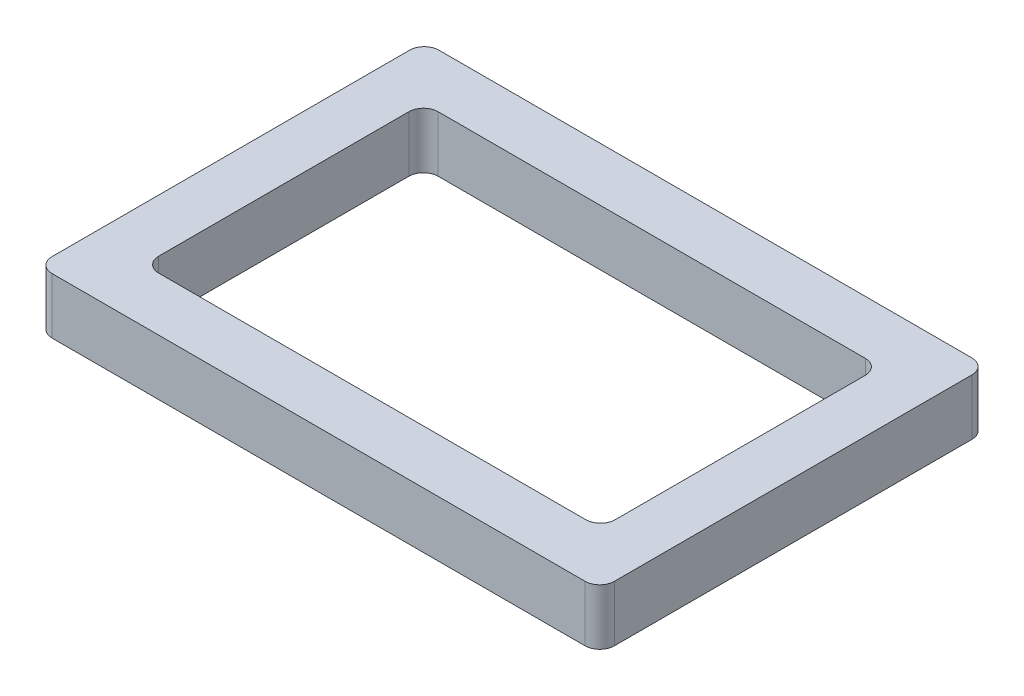
ISO-10303-21;
HEADER;
FILE_DESCRIPTION(('STEP AP214'),'2;1');
FILE_NAME('part.step','',(''),(''),'','','');
FILE_SCHEMA(('AUTOMOTIVE_DESIGN { 1 0 10303 214 1 1 1 1 }'));
ENDSEC;
DATA;
#1=APPLICATION_CONTEXT('core data for automotive mechanical design processes');
#2=APPLICATION_PROTOCOL_DEFINITION('international standard','automotive_design',2000,#1);
#3=PRODUCT_CONTEXT('',#1,'mechanical');
#4=PRODUCT('Part','Part','',(#3));
#5=PRODUCT_RELATED_PRODUCT_CATEGORY('part','',(#4));
#6=PRODUCT_DEFINITION_FORMATION('','',#4);
#7=PRODUCT_DEFINITION_CONTEXT('part definition',#1,'design');
#8=PRODUCT_DEFINITION('design','',#6,#7);
#9=PRODUCT_DEFINITION_SHAPE('','',#8);
#10=(LENGTH_UNIT() NAMED_UNIT(*) SI_UNIT(.MILLI.,.METRE.));
#11=(NAMED_UNIT(*) PLANE_ANGLE_UNIT() SI_UNIT($,.RADIAN.));
#12=(NAMED_UNIT(*) SI_UNIT($,.STERADIAN.) SOLID_ANGLE_UNIT());
#13=UNCERTAINTY_MEASURE_WITH_UNIT(LENGTH_MEASURE(1.E-05),#10,'distance_accuracy_value','');
#14=(GEOMETRIC_REPRESENTATION_CONTEXT(3) GLOBAL_UNCERTAINTY_ASSIGNED_CONTEXT((#13)) GLOBAL_UNIT_ASSIGNED_CONTEXT((#10,
#11,#12)) REPRESENTATION_CONTEXT('',''));
#15=CARTESIAN_POINT('',(0.,0.,0.));
#16=DIRECTION('',(0.,0.,1.));
#17=DIRECTION('',(1.,0.,0.));
#18=AXIS2_PLACEMENT_3D('',#15,#16,#17);
#19=CARTESIAN_POINT('',(-181.65,38.1,-121.85));
#20=DIRECTION('',(0.,-1.,0.));
#21=DIRECTION('',(0.,0.,-1.));
#22=AXIS2_PLACEMENT_3D('',#19,#20,#21);
#23=PLANE('',#22);
#24=CARTESIAN_POINT('',(-181.65,38.1,-121.85));
#25=DIRECTION('',(0.,1.,0.));
#26=DIRECTION('',(0.,0.,-1.));
#27=AXIS2_PLACEMENT_3D('',#24,#25,#26);
#28=CIRCLE('',#27,10.);
#29=CARTESIAN_POINT('',(-181.65,38.1,-131.85));
#30=VERTEX_POINT('',#29);
#31=CARTESIAN_POINT('',(-191.65,38.1,-121.85));
#32=VERTEX_POINT('',#31);
#33=EDGE_CURVE('E211',#30,#32,#28,.T.);
#34=ORIENTED_EDGE('',*,*,#33,.T.);
#35=DIRECTION('',(0.,0.,1.));
#36=VECTOR('',#35,1.);
#37=CARTESIAN_POINT('',(-191.65,38.1,121.85));
#38=LINE('',#37,#36);
#39=CARTESIAN_POINT('',(-191.65,38.1,121.85));
#40=VERTEX_POINT('',#39);
#41=EDGE_CURVE('E214',#32,#40,#38,.T.);
#42=ORIENTED_EDGE('',*,*,#41,.T.);
#43=CARTESIAN_POINT('',(-181.65,38.1,121.85));
#44=DIRECTION('',(0.,1.,0.));
#45=DIRECTION('',(0.,0.,1.));
#46=AXIS2_PLACEMENT_3D('',#43,#44,#45);
#47=CIRCLE('',#46,10.);
#48=CARTESIAN_POINT('',(-181.65,38.1,131.85));
#49=VERTEX_POINT('',#48);
#50=EDGE_CURVE('E217',#40,#49,#47,.T.);
#51=ORIENTED_EDGE('',*,*,#50,.T.);
#52=DIRECTION('',(1.,0.,0.));
#53=VECTOR('',#52,1.);
#54=CARTESIAN_POINT('',(-181.65,38.1,131.85));
#55=LINE('',#54,#53);
#56=CARTESIAN_POINT('',(181.65,38.1,131.85));
#57=VERTEX_POINT('',#56);
#58=EDGE_CURVE('E219',#49,#57,#55,.T.);
#59=ORIENTED_EDGE('',*,*,#58,.T.);
#60=CARTESIAN_POINT('',(181.65,38.1,121.85));
#61=DIRECTION('',(0.,1.,0.));
#62=DIRECTION('',(0.,0.,1.));
#63=AXIS2_PLACEMENT_3D('',#60,#61,#62);
#64=CIRCLE('',#63,10.);
#65=CARTESIAN_POINT('',(191.65,38.1,121.85));
#66=VERTEX_POINT('',#65);
#67=EDGE_CURVE('E221',#57,#66,#64,.T.);
#68=ORIENTED_EDGE('',*,*,#67,.T.);
#69=DIRECTION('',(0.,0.,-1.));
#70=VECTOR('',#69,1.);
#71=CARTESIAN_POINT('',(191.65,38.1,121.85));
#72=LINE('',#71,#70);
#73=CARTESIAN_POINT('',(191.65,38.1,-121.85));
#74=VERTEX_POINT('',#73);
#75=EDGE_CURVE('E223',#66,#74,#72,.T.);
#76=ORIENTED_EDGE('',*,*,#75,.T.);
#77=CARTESIAN_POINT('',(181.65,38.1,-121.85));
#78=DIRECTION('',(0.,1.,0.));
#79=DIRECTION('',(0.,0.,1.));
#80=AXIS2_PLACEMENT_3D('',#77,#78,#79);
#81=CIRCLE('',#80,10.);
#82=CARTESIAN_POINT('',(181.65,38.1,-131.85));
#83=VERTEX_POINT('',#82);
#84=EDGE_CURVE('E225',#74,#83,#81,.T.);
#85=ORIENTED_EDGE('',*,*,#84,.T.);
#86=DIRECTION('',(-1.,0.,0.));
#87=VECTOR('',#86,1.);
#88=CARTESIAN_POINT('',(-181.65,38.1,-131.85));
#89=LINE('',#88,#87);
#90=EDGE_CURVE('E227',#83,#30,#89,.T.);
#91=ORIENTED_EDGE('',*,*,#90,.T.);
#92=EDGE_LOOP('',(#34,#42,#51,#59,#68,#76,#85,#91));
#93=FACE_BOUND('',#92,.T.);
#94=CARTESIAN_POINT('',(-145.575,38.1,-85.25));
#95=DIRECTION('',(0.,1.,0.));
#96=DIRECTION('',(0.,0.,1.));
#97=AXIS2_PLACEMENT_3D('',#94,#95,#96);
#98=CIRCLE('',#97,10.);
#99=CARTESIAN_POINT('',(-145.575,38.1,-95.25));
#100=VERTEX_POINT('',#99);
#101=CARTESIAN_POINT('',(-155.575,38.1,-85.25));
#102=VERTEX_POINT('',#101);
#103=EDGE_CURVE('E146',#100,#102,#98,.T.);
#104=ORIENTED_EDGE('',*,*,#103,.F.);
#105=DIRECTION('',(-1.,0.,0.));
#106=VECTOR('',#105,1.);
#107=CARTESIAN_POINT('',(-145.575,38.1,-95.25));
#108=LINE('',#107,#106);
#109=CARTESIAN_POINT('',(145.575,38.1,-95.25));
#110=VERTEX_POINT('',#109);
#111=EDGE_CURVE('E179',#110,#100,#108,.T.);
#112=ORIENTED_EDGE('',*,*,#111,.F.);
#113=CARTESIAN_POINT('',(145.575,38.1,-85.25));
#114=DIRECTION('',(0.,1.,0.));
#115=DIRECTION('',(0.,0.,1.));
#116=AXIS2_PLACEMENT_3D('',#113,#114,#115);
#117=CIRCLE('',#116,10.);
#118=CARTESIAN_POINT('',(155.575,38.1,-85.25));
#119=VERTEX_POINT('',#118);
#120=EDGE_CURVE('E177',#119,#110,#117,.T.);
#121=ORIENTED_EDGE('',*,*,#120,.F.);
#122=DIRECTION('',(0.,0.,-1.));
#123=VECTOR('',#122,1.);
#124=CARTESIAN_POINT('',(155.575,38.1,85.2499999999999));
#125=LINE('',#124,#123);
#126=CARTESIAN_POINT('',(155.575,38.1,85.2499999999999));
#127=VERTEX_POINT('',#126);
#128=EDGE_CURVE('E175',#127,#119,#125,.T.);
#129=ORIENTED_EDGE('',*,*,#128,.F.);
#130=CARTESIAN_POINT('',(145.575,38.1,85.25));
#131=DIRECTION('',(0.,1.,0.));
#132=DIRECTION('',(0.,0.,1.));
#133=AXIS2_PLACEMENT_3D('',#130,#131,#132);
#134=CIRCLE('',#133,10.);
#135=CARTESIAN_POINT('',(145.575,38.1,95.25));
#136=VERTEX_POINT('',#135);
#137=EDGE_CURVE('E173',#136,#127,#134,.T.);
#138=ORIENTED_EDGE('',*,*,#137,.F.);
#139=DIRECTION('',(1.,0.,0.));
#140=VECTOR('',#139,1.);
#141=CARTESIAN_POINT('',(-145.575,38.1,95.25));
#142=LINE('',#141,#140);
#143=CARTESIAN_POINT('',(-145.575,38.1,95.25));
#144=VERTEX_POINT('',#143);
#145=EDGE_CURVE('E169',#144,#136,#142,.T.);
#146=ORIENTED_EDGE('',*,*,#145,.F.);
#147=CARTESIAN_POINT('',(-145.575,38.1,85.25));
#148=DIRECTION('',(0.,1.,0.));
#149=DIRECTION('',(0.,0.,1.));
#150=AXIS2_PLACEMENT_3D('',#147,#148,#149);
#151=CIRCLE('',#150,10.);
#152=CARTESIAN_POINT('',(-155.575,38.1,85.2499999999999));
#153=VERTEX_POINT('',#152);
#154=EDGE_CURVE('E167',#153,#144,#151,.T.);
#155=ORIENTED_EDGE('',*,*,#154,.F.);
#156=DIRECTION('',(0.,0.,1.));
#157=VECTOR('',#156,1.);
#158=CARTESIAN_POINT('',(-155.575,38.1,85.2499999999999));
#159=LINE('',#158,#157);
#160=EDGE_CURVE('E154',#102,#153,#159,.T.);
#161=ORIENTED_EDGE('',*,*,#160,.F.);
#162=EDGE_LOOP('',(#104,#112,#121,#129,#138,#146,#155,#161));
#163=FACE_BOUND('',#162,.T.);
#164=ADVANCED_FACE('F33',(#93,#163),#23,.F.);
#165=CARTESIAN_POINT('',(-181.65,0.,-121.85));
#166=DIRECTION('',(0.,-1.,0.));
#167=DIRECTION('',(0.,0.,-1.));
#168=AXIS2_PLACEMENT_3D('',#165,#166,#167);
#169=PLANE('',#168);
#170=CARTESIAN_POINT('',(-181.65,0.,-121.85));
#171=DIRECTION('',(0.,1.,0.));
#172=DIRECTION('',(0.,0.,-1.));
#173=AXIS2_PLACEMENT_3D('',#170,#171,#172);
#174=CIRCLE('',#173,10.);
#175=CARTESIAN_POINT('',(-181.65,0.,-131.85));
#176=VERTEX_POINT('',#175);
#177=CARTESIAN_POINT('',(-191.65,0.,-121.85));
#178=VERTEX_POINT('',#177);
#179=EDGE_CURVE('E162',#176,#178,#174,.T.);
#180=ORIENTED_EDGE('',*,*,#179,.F.);
#181=DIRECTION('',(-1.,0.,0.));
#182=VECTOR('',#181,1.);
#183=CARTESIAN_POINT('',(-181.65,0.,-131.85));
#184=LINE('',#183,#182);
#185=CARTESIAN_POINT('',(181.65,0.,-131.85));
#186=VERTEX_POINT('',#185);
#187=EDGE_CURVE('E215',#186,#176,#184,.T.);
#188=ORIENTED_EDGE('',*,*,#187,.F.);
#189=CARTESIAN_POINT('',(181.65,0.,-121.85));
#190=DIRECTION('',(0.,1.,0.));
#191=DIRECTION('',(0.,0.,1.));
#192=AXIS2_PLACEMENT_3D('',#189,#190,#191);
#193=CIRCLE('',#192,10.);
#194=CARTESIAN_POINT('',(191.65,0.,-121.85));
#195=VERTEX_POINT('',#194);
#196=EDGE_CURVE('E242',#195,#186,#193,.T.);
#197=ORIENTED_EDGE('',*,*,#196,.F.);
#198=DIRECTION('',(0.,0.,-1.));
#199=VECTOR('',#198,1.);
#200=CARTESIAN_POINT('',(191.65,0.,121.85));
#201=LINE('',#200,#199);
#202=CARTESIAN_POINT('',(191.65,0.,121.85));
#203=VERTEX_POINT('',#202);
#204=EDGE_CURVE('E240',#203,#195,#201,.T.);
#205=ORIENTED_EDGE('',*,*,#204,.F.);
#206=CARTESIAN_POINT('',(181.65,0.,121.85));
#207=DIRECTION('',(0.,1.,0.));
#208=DIRECTION('',(0.,0.,1.));
#209=AXIS2_PLACEMENT_3D('',#206,#207,#208);
#210=CIRCLE('',#209,10.);
#211=CARTESIAN_POINT('',(181.65,0.,131.85));
#212=VERTEX_POINT('',#211);
#213=EDGE_CURVE('E238',#212,#203,#210,.T.);
#214=ORIENTED_EDGE('',*,*,#213,.F.);
#215=DIRECTION('',(1.,0.,0.));
#216=VECTOR('',#215,1.);
#217=CARTESIAN_POINT('',(-181.65,0.,131.85));
#218=LINE('',#217,#216);
#219=CARTESIAN_POINT('',(-181.65,0.,131.85));
#220=VERTEX_POINT('',#219);
#221=EDGE_CURVE('E236',#220,#212,#218,.T.);
#222=ORIENTED_EDGE('',*,*,#221,.F.);
#223=CARTESIAN_POINT('',(-181.65,0.,121.85));
#224=DIRECTION('',(0.,1.,0.));
#225=DIRECTION('',(0.,0.,1.));
#226=AXIS2_PLACEMENT_3D('',#223,#224,#225);
#227=CIRCLE('',#226,10.);
#228=CARTESIAN_POINT('',(-191.65,0.,121.85));
#229=VERTEX_POINT('',#228);
#230=EDGE_CURVE('E234',#229,#220,#227,.T.);
#231=ORIENTED_EDGE('',*,*,#230,.F.);
#232=DIRECTION('',(0.,0.,1.));
#233=VECTOR('',#232,1.);
#234=CARTESIAN_POINT('',(-191.65,0.,121.85));
#235=LINE('',#234,#233);
#236=EDGE_CURVE('E232',#178,#229,#235,.T.);
#237=ORIENTED_EDGE('',*,*,#236,.F.);
#238=EDGE_LOOP('',(#180,#188,#197,#205,#214,#222,#231,#237));
#239=FACE_BOUND('',#238,.T.);
#240=DIRECTION('',(-1.,0.,0.));
#241=VECTOR('',#240,1.);
#242=CARTESIAN_POINT('',(-145.575,0.,-95.25));
#243=LINE('',#242,#241);
#244=CARTESIAN_POINT('',(145.575,0.,-95.25));
#245=VERTEX_POINT('',#244);
#246=CARTESIAN_POINT('',(-145.575,0.,-95.25));
#247=VERTEX_POINT('',#246);
#248=EDGE_CURVE('E155',#245,#247,#243,.T.);
#249=ORIENTED_EDGE('',*,*,#248,.T.);
#250=CARTESIAN_POINT('',(-145.575,0.,-85.25));
#251=DIRECTION('',(0.,1.,0.));
#252=DIRECTION('',(0.,0.,1.));
#253=AXIS2_PLACEMENT_3D('',#250,#251,#252);
#254=CIRCLE('',#253,10.);
#255=CARTESIAN_POINT('',(-155.575,0.,-85.25));
#256=VERTEX_POINT('',#255);
#257=EDGE_CURVE('E56',#247,#256,#254,.T.);
#258=ORIENTED_EDGE('',*,*,#257,.T.);
#259=DIRECTION('',(0.,0.,1.));
#260=VECTOR('',#259,1.);
#261=CARTESIAN_POINT('',(-155.575,0.,85.2499999999999));
#262=LINE('',#261,#260);
#263=CARTESIAN_POINT('',(-155.575,0.,85.2499999999999));
#264=VERTEX_POINT('',#263);
#265=EDGE_CURVE('E161',#256,#264,#262,.T.);
#266=ORIENTED_EDGE('',*,*,#265,.T.);
#267=CARTESIAN_POINT('',(-145.575,0.,85.25));
#268=DIRECTION('',(0.,1.,0.));
#269=DIRECTION('',(0.,0.,1.));
#270=AXIS2_PLACEMENT_3D('',#267,#268,#269);
#271=CIRCLE('',#270,10.);
#272=CARTESIAN_POINT('',(-145.575,0.,95.25));
#273=VERTEX_POINT('',#272);
#274=EDGE_CURVE('E183',#264,#273,#271,.T.);
#275=ORIENTED_EDGE('',*,*,#274,.T.);
#276=DIRECTION('',(1.,0.,0.));
#277=VECTOR('',#276,1.);
#278=CARTESIAN_POINT('',(-145.575,0.,95.25));
#279=LINE('',#278,#277);
#280=CARTESIAN_POINT('',(145.575,0.,95.25));
#281=VERTEX_POINT('',#280);
#282=EDGE_CURVE('E186',#273,#281,#279,.T.);
#283=ORIENTED_EDGE('',*,*,#282,.T.);
#284=CARTESIAN_POINT('',(145.575,0.,85.25));
#285=DIRECTION('',(0.,1.,0.));
#286=DIRECTION('',(0.,0.,1.));
#287=AXIS2_PLACEMENT_3D('',#284,#285,#286);
#288=CIRCLE('',#287,10.);
#289=CARTESIAN_POINT('',(155.575,0.,85.2499999999999));
#290=VERTEX_POINT('',#289);
#291=EDGE_CURVE('E189',#281,#290,#288,.T.);
#292=ORIENTED_EDGE('',*,*,#291,.T.);
#293=DIRECTION('',(0.,0.,-1.));
#294=VECTOR('',#293,1.);
#295=CARTESIAN_POINT('',(155.575,0.,85.2499999999999));
#296=LINE('',#295,#294);
#297=CARTESIAN_POINT('',(155.575,0.,-85.25));
#298=VERTEX_POINT('',#297);
#299=EDGE_CURVE('E192',#290,#298,#296,.T.);
#300=ORIENTED_EDGE('',*,*,#299,.T.);
#301=CARTESIAN_POINT('',(145.575,0.,-85.25));
#302=DIRECTION('',(0.,1.,0.));
#303=DIRECTION('',(0.,0.,1.));
#304=AXIS2_PLACEMENT_3D('',#301,#302,#303);
#305=CIRCLE('',#304,10.);
#306=EDGE_CURVE('E195',#298,#245,#305,.T.);
#307=ORIENTED_EDGE('',*,*,#306,.T.);
#308=EDGE_LOOP('',(#249,#258,#266,#275,#283,#292,#300,#307));
#309=FACE_BOUND('',#308,.T.);
#310=ADVANCED_FACE('F272',(#239,#309),#169,.T.);
#311=CARTESIAN_POINT('',(-181.65,38.1,-121.85));
#312=DIRECTION('',(0.,-1.,0.));
#313=DIRECTION('',(0.,0.,-1.));
#314=AXIS2_PLACEMENT_3D('',#311,#312,#313);
#315=CYLINDRICAL_SURFACE('',#314,10.);
#316=ORIENTED_EDGE('',*,*,#179,.T.);
#317=DIRECTION('',(0.,-1.,0.));
#318=VECTOR('',#317,1.);
#319=CARTESIAN_POINT('',(-191.65,38.1,-121.85));
#320=LINE('',#319,#318);
#321=EDGE_CURVE('E11',#32,#178,#320,.T.);
#322=ORIENTED_EDGE('',*,*,#321,.F.);
#323=ORIENTED_EDGE('',*,*,#33,.F.);
#324=DIRECTION('',(0.,-1.,0.));
#325=VECTOR('',#324,1.);
#326=CARTESIAN_POINT('',(-181.65,38.1,-131.85));
#327=LINE('',#326,#325);
#328=EDGE_CURVE('E229',#30,#176,#327,.T.);
#329=ORIENTED_EDGE('',*,*,#328,.T.);
#330=EDGE_LOOP('',(#316,#322,#323,#329));
#331=FACE_BOUND('',#330,.T.);
#332=ADVANCED_FACE('F35',(#331),#315,.T.);
#333=CARTESIAN_POINT('',(-191.65,38.1,121.85));
#334=DIRECTION('',(1.,0.,0.));
#335=DIRECTION('',(0.,0.,-1.));
#336=AXIS2_PLACEMENT_3D('',#333,#334,#335);
#337=PLANE('',#336);
#338=ORIENTED_EDGE('',*,*,#236,.T.);
#339=DIRECTION('',(0.,-1.,0.));
#340=VECTOR('',#339,1.);
#341=CARTESIAN_POINT('',(-191.65,38.1,121.85));
#342=LINE('',#341,#340);
#343=EDGE_CURVE('E41',#40,#229,#342,.T.);
#344=ORIENTED_EDGE('',*,*,#343,.F.);
#345=ORIENTED_EDGE('',*,*,#41,.F.);
#346=ORIENTED_EDGE('',*,*,#321,.T.);
#347=EDGE_LOOP('',(#338,#344,#345,#346));
#348=FACE_BOUND('',#347,.T.);
#349=ADVANCED_FACE('F289',(#348),#337,.F.);
#350=CARTESIAN_POINT('',(-181.65,38.1,121.85));
#351=DIRECTION('',(0.,-1.,0.));
#352=DIRECTION('',(0.,0.,-1.));
#353=AXIS2_PLACEMENT_3D('',#350,#351,#352);
#354=CYLINDRICAL_SURFACE('',#353,10.);
#355=ORIENTED_EDGE('',*,*,#230,.T.);
#356=DIRECTION('',(0.,-1.,0.));
#357=VECTOR('',#356,1.);
#358=CARTESIAN_POINT('',(-181.65,38.1,131.85));
#359=LINE('',#358,#357);
#360=EDGE_CURVE('E259',#49,#220,#359,.T.);
#361=ORIENTED_EDGE('',*,*,#360,.F.);
#362=ORIENTED_EDGE('',*,*,#50,.F.);
#363=ORIENTED_EDGE('',*,*,#343,.T.);
#364=EDGE_LOOP('',(#355,#361,#362,#363));
#365=FACE_BOUND('',#364,.T.);
#366=ADVANCED_FACE('F266',(#365),#354,.T.);
#367=CARTESIAN_POINT('',(-181.65,38.1,131.85));
#368=DIRECTION('',(0.,0.,-1.));
#369=DIRECTION('',(-1.,0.,0.));
#370=AXIS2_PLACEMENT_3D('',#367,#368,#369);
#371=PLANE('',#370);
#372=ORIENTED_EDGE('',*,*,#221,.T.);
#373=DIRECTION('',(0.,-1.,0.));
#374=VECTOR('',#373,1.);
#375=CARTESIAN_POINT('',(181.65,38.1,131.85));
#376=LINE('',#375,#374);
#377=EDGE_CURVE('E256',#57,#212,#376,.T.);
#378=ORIENTED_EDGE('',*,*,#377,.F.);
#379=ORIENTED_EDGE('',*,*,#58,.F.);
#380=ORIENTED_EDGE('',*,*,#360,.T.);
#381=EDGE_LOOP('',(#372,#378,#379,#380));
#382=FACE_BOUND('',#381,.T.);
#383=ADVANCED_FACE('F278',(#382),#371,.F.);
#384=CARTESIAN_POINT('',(181.65,38.1,121.85));
#385=DIRECTION('',(0.,-1.,0.));
#386=DIRECTION('',(0.,0.,-1.));
#387=AXIS2_PLACEMENT_3D('',#384,#385,#386);
#388=CYLINDRICAL_SURFACE('',#387,10.);
#389=ORIENTED_EDGE('',*,*,#213,.T.);
#390=DIRECTION('',(0.,-1.,0.));
#391=VECTOR('',#390,1.);
#392=CARTESIAN_POINT('',(191.65,38.1,121.85));
#393=LINE('',#392,#391);
#394=EDGE_CURVE('E253',#66,#203,#393,.T.);
#395=ORIENTED_EDGE('',*,*,#394,.F.);
#396=ORIENTED_EDGE('',*,*,#67,.F.);
#397=ORIENTED_EDGE('',*,*,#377,.T.);
#398=EDGE_LOOP('',(#389,#395,#396,#397));
#399=FACE_BOUND('',#398,.T.);
#400=ADVANCED_FACE('F282',(#399),#388,.T.);
#401=CARTESIAN_POINT('',(191.65,38.1,121.85));
#402=DIRECTION('',(-1.,0.,0.));
#403=DIRECTION('',(0.,0.,1.));
#404=AXIS2_PLACEMENT_3D('',#401,#402,#403);
#405=PLANE('',#404);
#406=ORIENTED_EDGE('',*,*,#204,.T.);
#407=DIRECTION('',(0.,-1.,0.));
#408=VECTOR('',#407,1.);
#409=CARTESIAN_POINT('',(191.65,38.1,-121.85));
#410=LINE('',#409,#408);
#411=EDGE_CURVE('E250',#74,#195,#410,.T.);
#412=ORIENTED_EDGE('',*,*,#411,.F.);
#413=ORIENTED_EDGE('',*,*,#75,.F.);
#414=ORIENTED_EDGE('',*,*,#394,.T.);
#415=EDGE_LOOP('',(#406,#412,#413,#414));
#416=FACE_BOUND('',#415,.T.);
#417=ADVANCED_FACE('F302',(#416),#405,.F.);
#418=CARTESIAN_POINT('',(181.65,38.1,-121.85));
#419=DIRECTION('',(0.,-1.,0.));
#420=DIRECTION('',(0.,0.,-1.));
#421=AXIS2_PLACEMENT_3D('',#418,#419,#420);
#422=CYLINDRICAL_SURFACE('',#421,10.);
#423=ORIENTED_EDGE('',*,*,#196,.T.);
#424=DIRECTION('',(0.,-1.,0.));
#425=VECTOR('',#424,1.);
#426=CARTESIAN_POINT('',(181.65,38.1,-131.85));
#427=LINE('',#426,#425);
#428=EDGE_CURVE('E247',#83,#186,#427,.T.);
#429=ORIENTED_EDGE('',*,*,#428,.F.);
#430=ORIENTED_EDGE('',*,*,#84,.F.);
#431=ORIENTED_EDGE('',*,*,#411,.T.);
#432=EDGE_LOOP('',(#423,#429,#430,#431));
#433=FACE_BOUND('',#432,.T.);
#434=ADVANCED_FACE('F300',(#433),#422,.T.);
#435=CARTESIAN_POINT('',(-181.65,38.1,-131.85));
#436=DIRECTION('',(0.,0.,1.));
#437=DIRECTION('',(1.,0.,0.));
#438=AXIS2_PLACEMENT_3D('',#435,#436,#437);
#439=PLANE('',#438);
#440=ORIENTED_EDGE('',*,*,#187,.T.);
#441=ORIENTED_EDGE('',*,*,#328,.F.);
#442=ORIENTED_EDGE('',*,*,#90,.F.);
#443=ORIENTED_EDGE('',*,*,#428,.T.);
#444=EDGE_LOOP('',(#440,#441,#442,#443));
#445=FACE_BOUND('',#444,.T.);
#446=ADVANCED_FACE('F295',(#445),#439,.F.);
#447=CARTESIAN_POINT('',(-145.575,38.1,-85.25));
#448=DIRECTION('',(0.,-1.,0.));
#449=DIRECTION('',(0.,0.,-1.));
#450=AXIS2_PLACEMENT_3D('',#447,#448,#449);
#451=CYLINDRICAL_SURFACE('',#450,10.);
#452=ORIENTED_EDGE('',*,*,#257,.F.);
#453=DIRECTION('',(0.,-1.,0.));
#454=VECTOR('',#453,1.);
#455=CARTESIAN_POINT('',(-145.575,38.1,-95.25));
#456=LINE('',#455,#454);
#457=EDGE_CURVE('E150',#100,#247,#456,.T.);
#458=ORIENTED_EDGE('',*,*,#457,.F.);
#459=ORIENTED_EDGE('',*,*,#103,.T.);
#460=DIRECTION('',(0.,-1.,0.));
#461=VECTOR('',#460,1.);
#462=CARTESIAN_POINT('',(-155.575,38.1,-85.25));
#463=LINE('',#462,#461);
#464=EDGE_CURVE('E149',#102,#256,#463,.T.);
#465=ORIENTED_EDGE('',*,*,#464,.T.);
#466=EDGE_LOOP('',(#452,#458,#459,#465));
#467=FACE_BOUND('',#466,.T.);
#468=ADVANCED_FACE('F148',(#467),#451,.F.);
#469=CARTESIAN_POINT('',(-155.575,38.1,85.2499999999999));
#470=DIRECTION('',(1.,0.,0.));
#471=DIRECTION('',(0.,0.,-1.));
#472=AXIS2_PLACEMENT_3D('',#469,#470,#471);
#473=PLANE('',#472);
#474=ORIENTED_EDGE('',*,*,#265,.F.);
#475=ORIENTED_EDGE('',*,*,#464,.F.);
#476=ORIENTED_EDGE('',*,*,#160,.T.);
#477=DIRECTION('',(0.,-1.,0.));
#478=VECTOR('',#477,1.);
#479=CARTESIAN_POINT('',(-155.575,38.1,85.2499999999999));
#480=LINE('',#479,#478);
#481=EDGE_CURVE('E163',#153,#264,#480,.T.);
#482=ORIENTED_EDGE('',*,*,#481,.T.);
#483=EDGE_LOOP('',(#474,#475,#476,#482));
#484=FACE_BOUND('',#483,.T.);
#485=ADVANCED_FACE('F158',(#484),#473,.T.);
#486=CARTESIAN_POINT('',(-145.575,38.1,85.25));
#487=DIRECTION('',(0.,-1.,0.));
#488=DIRECTION('',(0.,0.,-1.));
#489=AXIS2_PLACEMENT_3D('',#486,#487,#488);
#490=CYLINDRICAL_SURFACE('',#489,10.);
#491=ORIENTED_EDGE('',*,*,#274,.F.);
#492=ORIENTED_EDGE('',*,*,#481,.F.);
#493=ORIENTED_EDGE('',*,*,#154,.T.);
#494=DIRECTION('',(0.,-1.,0.));
#495=VECTOR('',#494,1.);
#496=CARTESIAN_POINT('',(-145.575,38.1,95.25));
#497=LINE('',#496,#495);
#498=EDGE_CURVE('E208',#144,#273,#497,.T.);
#499=ORIENTED_EDGE('',*,*,#498,.T.);
#500=EDGE_LOOP('',(#491,#492,#493,#499));
#501=FACE_BOUND('',#500,.T.);
#502=ADVANCED_FACE('F327',(#501),#490,.F.);
#503=CARTESIAN_POINT('',(-145.575,38.1,95.25));
#504=DIRECTION('',(0.,0.,-1.));
#505=DIRECTION('',(-1.,0.,0.));
#506=AXIS2_PLACEMENT_3D('',#503,#504,#505);
#507=PLANE('',#506);
#508=ORIENTED_EDGE('',*,*,#282,.F.);
#509=ORIENTED_EDGE('',*,*,#498,.F.);
#510=ORIENTED_EDGE('',*,*,#145,.T.);
#511=DIRECTION('',(0.,-1.,0.));
#512=VECTOR('',#511,1.);
#513=CARTESIAN_POINT('',(145.575,38.1,95.25));
#514=LINE('',#513,#512);
#515=EDGE_CURVE('E206',#136,#281,#514,.T.);
#516=ORIENTED_EDGE('',*,*,#515,.T.);
#517=EDGE_LOOP('',(#508,#509,#510,#516));
#518=FACE_BOUND('',#517,.T.);
#519=ADVANCED_FACE('F331',(#518),#507,.T.);
#520=CARTESIAN_POINT('',(145.575,38.1,85.25));
#521=DIRECTION('',(0.,-1.,0.));
#522=DIRECTION('',(0.,0.,-1.));
#523=AXIS2_PLACEMENT_3D('',#520,#521,#522);
#524=CYLINDRICAL_SURFACE('',#523,10.);
#525=ORIENTED_EDGE('',*,*,#291,.F.);
#526=ORIENTED_EDGE('',*,*,#515,.F.);
#527=ORIENTED_EDGE('',*,*,#137,.T.);
#528=DIRECTION('',(0.,-1.,0.));
#529=VECTOR('',#528,1.);
#530=CARTESIAN_POINT('',(155.575,38.1,85.2499999999999));
#531=LINE('',#530,#529);
#532=EDGE_CURVE('E204',#127,#290,#531,.T.);
#533=ORIENTED_EDGE('',*,*,#532,.T.);
#534=EDGE_LOOP('',(#525,#526,#527,#533));
#535=FACE_BOUND('',#534,.T.);
#536=ADVANCED_FACE('F337',(#535),#524,.F.);
#537=CARTESIAN_POINT('',(155.575,38.1,85.2499999999999));
#538=DIRECTION('',(-1.,0.,0.));
#539=DIRECTION('',(0.,0.,1.));
#540=AXIS2_PLACEMENT_3D('',#537,#538,#539);
#541=PLANE('',#540);
#542=ORIENTED_EDGE('',*,*,#299,.F.);
#543=ORIENTED_EDGE('',*,*,#532,.F.);
#544=ORIENTED_EDGE('',*,*,#128,.T.);
#545=DIRECTION('',(0.,-1.,0.));
#546=VECTOR('',#545,1.);
#547=CARTESIAN_POINT('',(155.575,38.1,-85.25));
#548=LINE('',#547,#546);
#549=EDGE_CURVE('E202',#119,#298,#548,.T.);
#550=ORIENTED_EDGE('',*,*,#549,.T.);
#551=EDGE_LOOP('',(#542,#543,#544,#550));
#552=FACE_BOUND('',#551,.T.);
#553=ADVANCED_FACE('F341',(#552),#541,.T.);
#554=CARTESIAN_POINT('',(145.575,38.1,-85.25));
#555=DIRECTION('',(0.,-1.,0.));
#556=DIRECTION('',(0.,0.,-1.));
#557=AXIS2_PLACEMENT_3D('',#554,#555,#556);
#558=CYLINDRICAL_SURFACE('',#557,10.);
#559=ORIENTED_EDGE('',*,*,#306,.F.);
#560=ORIENTED_EDGE('',*,*,#549,.F.);
#561=ORIENTED_EDGE('',*,*,#120,.T.);
#562=DIRECTION('',(0.,-1.,0.));
#563=VECTOR('',#562,1.);
#564=CARTESIAN_POINT('',(145.575,38.1,-95.25));
#565=LINE('',#564,#563);
#566=EDGE_CURVE('E48',#110,#245,#565,.T.);
#567=ORIENTED_EDGE('',*,*,#566,.T.);
#568=EDGE_LOOP('',(#559,#560,#561,#567));
#569=FACE_BOUND('',#568,.T.);
#570=ADVANCED_FACE('F345',(#569),#558,.F.);
#571=CARTESIAN_POINT('',(-145.575,38.1,-95.25));
#572=DIRECTION('',(0.,0.,1.));
#573=DIRECTION('',(1.,0.,0.));
#574=AXIS2_PLACEMENT_3D('',#571,#572,#573);
#575=PLANE('',#574);
#576=ORIENTED_EDGE('',*,*,#248,.F.);
#577=ORIENTED_EDGE('',*,*,#566,.F.);
#578=ORIENTED_EDGE('',*,*,#111,.T.);
#579=ORIENTED_EDGE('',*,*,#457,.T.);
#580=EDGE_LOOP('',(#576,#577,#578,#579));
#581=FACE_BOUND('',#580,.T.);
#582=ADVANCED_FACE('F349',(#581),#575,.T.);
#583=CLOSED_SHELL('',(#164,#310,#332,#349,#366,#383,#400,#417,#434,#446,#468,#485,#502,#519,
#536,#553,#570,#582));
#584=MANIFOLD_SOLID_BREP('B2',#583);
#585=ADVANCED_BREP_SHAPE_REPRESENTATION('',(#18,#584),#14);
#586=SHAPE_DEFINITION_REPRESENTATION(#9,#585);
ENDSEC;
END-ISO-10303-21;
